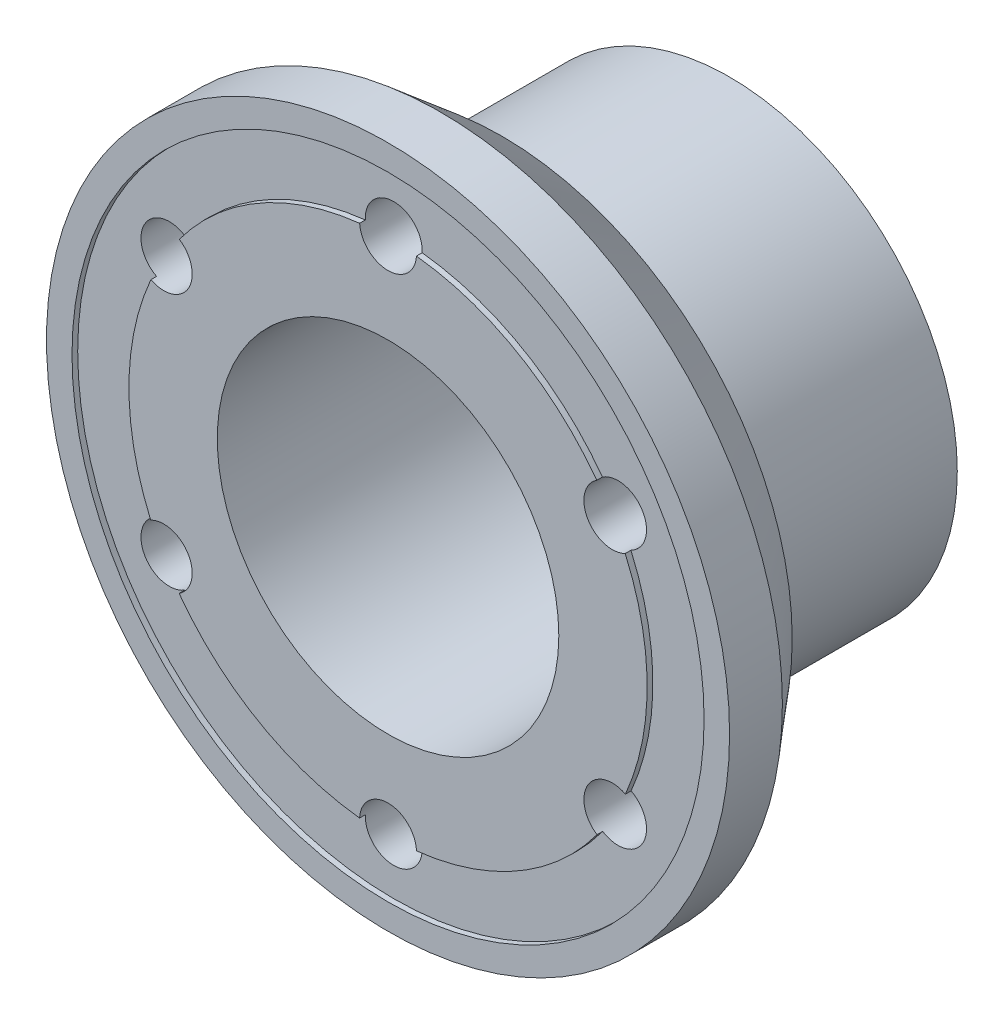
ISO-10303-21;
HEADER;
FILE_DESCRIPTION(('STEP AP214'),'2;1');
FILE_NAME('part.step','',(''),(''),'','','');
FILE_SCHEMA(('AUTOMOTIVE_DESIGN { 1 0 10303 214 1 1 1 1 }'));
ENDSEC;
DATA;
#1=APPLICATION_CONTEXT('core data for automotive mechanical design processes');
#2=APPLICATION_PROTOCOL_DEFINITION('international standard','automotive_design',2000,#1);
#3=PRODUCT_CONTEXT('',#1,'mechanical');
#4=PRODUCT('Part','Part','',(#3));
#5=PRODUCT_RELATED_PRODUCT_CATEGORY('part','',(#4));
#6=PRODUCT_DEFINITION_FORMATION('','',#4);
#7=PRODUCT_DEFINITION_CONTEXT('part definition',#1,'design');
#8=PRODUCT_DEFINITION('design','',#6,#7);
#9=PRODUCT_DEFINITION_SHAPE('','',#8);
#10=(LENGTH_UNIT() NAMED_UNIT(*) SI_UNIT(.MILLI.,.METRE.));
#11=(NAMED_UNIT(*) PLANE_ANGLE_UNIT() SI_UNIT($,.RADIAN.));
#12=(NAMED_UNIT(*) SI_UNIT($,.STERADIAN.) SOLID_ANGLE_UNIT());
#13=UNCERTAINTY_MEASURE_WITH_UNIT(LENGTH_MEASURE(1.E-05),#10,'distance_accuracy_value','');
#14=(GEOMETRIC_REPRESENTATION_CONTEXT(3) GLOBAL_UNCERTAINTY_ASSIGNED_CONTEXT((#13)) GLOBAL_UNIT_ASSIGNED_CONTEXT((#10,
#11,#12)) REPRESENTATION_CONTEXT('',''));
#15=CARTESIAN_POINT('',(0.,0.,0.));
#16=DIRECTION('',(0.,0.,1.));
#17=DIRECTION('',(1.,0.,0.));
#18=AXIS2_PLACEMENT_3D('',#15,#16,#17);
#19=CARTESIAN_POINT('',(0.,0.,60.));
#20=DIRECTION('',(0.,0.,1.));
#21=DIRECTION('',(1.,0.,0.));
#22=AXIS2_PLACEMENT_3D('',#19,#20,#21);
#23=PLANE('',#22);
#24=CARTESIAN_POINT('',(0.,0.,60.));
#25=DIRECTION('',(0.,0.,1.));
#26=DIRECTION('',(1.,0.,0.));
#27=AXIS2_PLACEMENT_3D('',#24,#25,#26);
#28=CIRCLE('',#27,30.);
#29=CARTESIAN_POINT('',(30.,0.,60.));
#30=VERTEX_POINT('',#29);
#31=EDGE_CURVE('E213',#30,#30,#28,.T.);
#32=ORIENTED_EDGE('',*,*,#31,.F.);
#33=EDGE_LOOP('',(#32));
#34=FACE_BOUND('',#33,.T.);
#35=CARTESIAN_POINT('',(39.4041558721932,22.7915878367293,60.));
#36=DIRECTION('',(0.,0.,1.));
#37=DIRECTION('',(1.,0.,0.));
#38=AXIS2_PLACEMENT_3D('',#35,#36,#37);
#39=CIRCLE('',#38,5.);
#40=CARTESIAN_POINT('',(36.6668073140902,26.9757153289852,60.));
#41=VERTEX_POINT('',#40);
#42=CARTESIAN_POINT('',(41.6661012207834,18.3324844246081,60.));
#43=VERTEX_POINT('',#42);
#44=EDGE_CURVE('E183',#41,#43,#39,.T.);
#45=ORIENTED_EDGE('',*,*,#44,.F.);
#46=CARTESIAN_POINT('',(0.,0.,60.));
#47=DIRECTION('',(0.,0.,1.));
#48=DIRECTION('',(1.,0.,0.));
#49=AXIS2_PLACEMENT_3D('',#46,#47,#48);
#50=CIRCLE('',#49,45.5208081663657);
#51=CARTESIAN_POINT('',(4.9912751710628,45.2463385069532,60.));
#52=VERTEX_POINT('',#51);
#53=EDGE_CURVE('E190',#41,#52,#50,.T.);
#54=ORIENTED_EDGE('',*,*,#53,.T.);
#55=CARTESIAN_POINT('',(0.,45.5415878367273,60.));
#56=DIRECTION('',(0.,0.,1.));
#57=DIRECTION('',(1.,0.,0.));
#58=AXIS2_PLACEMENT_3D('',#55,#56,#57);
#59=CIRCLE('',#58,5.);
#60=CARTESIAN_POINT('',(-4.9912751710628,45.2463385069532,60.));
#61=VERTEX_POINT('',#60);
#62=EDGE_CURVE('E209',#61,#52,#59,.T.);
#63=ORIENTED_EDGE('',*,*,#62,.F.);
#64=CARTESIAN_POINT('',(-36.6668073140911,26.975715328984,60.));
#65=VERTEX_POINT('',#64);
#66=EDGE_CURVE('E308',#61,#65,#50,.T.);
#67=ORIENTED_EDGE('',*,*,#66,.T.);
#68=CARTESIAN_POINT('',(-39.4041558721905,22.7915878367257,60.));
#69=DIRECTION('',(0.,0.,1.));
#70=DIRECTION('',(1.,0.,0.));
#71=AXIS2_PLACEMENT_3D('',#68,#69,#70);
#72=CIRCLE('',#71,5.);
#73=CARTESIAN_POINT('',(-41.6661012207842,18.3324844246063,60.));
#74=VERTEX_POINT('',#73);
#75=EDGE_CURVE('E228',#74,#65,#72,.T.);
#76=ORIENTED_EDGE('',*,*,#75,.F.);
#77=CARTESIAN_POINT('',(-41.6959205817945,-18.2645608476019,60.));
#78=VERTEX_POINT('',#77);
#79=EDGE_CURVE('E83',#74,#78,#50,.T.);
#80=ORIENTED_EDGE('',*,*,#79,.T.);
#81=CARTESIAN_POINT('',(-39.4041558721885,-22.7084121632744,60.));
#82=DIRECTION('',(0.,0.,1.));
#83=DIRECTION('',(1.,0.,0.));
#84=AXIS2_PLACEMENT_3D('',#81,#82,#83);
#85=CIRCLE('',#84,5.);
#86=CARTESIAN_POINT('',(-36.7082161891251,-26.9193395225723,60.));
#87=VERTEX_POINT('',#86);
#88=EDGE_CURVE('E224',#87,#78,#85,.T.);
#89=ORIENTED_EDGE('',*,*,#88,.F.);
#90=CARTESIAN_POINT('',(-4.99548072668879,-45.2458743801946,60.));
#91=VERTEX_POINT('',#90);
#92=EDGE_CURVE('E311',#87,#91,#50,.T.);
#93=ORIENTED_EDGE('',*,*,#92,.T.);
#94=CARTESIAN_POINT('',(4.50944079798348E-12,-45.4584121632727,60.));
#95=DIRECTION('',(0.,0.,1.));
#96=DIRECTION('',(1.,0.,0.));
#97=AXIS2_PLACEMENT_3D('',#94,#95,#96);
#98=CIRCLE('',#97,5.);
#99=CARTESIAN_POINT('',(4.99548072669777,-45.2458743801936,60.));
#100=VERTEX_POINT('',#99);
#101=EDGE_CURVE('E220',#100,#91,#98,.T.);
#102=ORIENTED_EDGE('',*,*,#101,.F.);
#103=CARTESIAN_POINT('',(36.7082161891291,-26.9193395225668,60.));
#104=VERTEX_POINT('',#103);
#105=EDGE_CURVE('E193',#100,#104,#50,.T.);
#106=ORIENTED_EDGE('',*,*,#105,.T.);
#107=CARTESIAN_POINT('',(39.4041558721955,-22.7084121632708,60.));
#108=DIRECTION('',(0.,0.,1.));
#109=DIRECTION('',(1.,0.,0.));
#110=AXIS2_PLACEMENT_3D('',#107,#108,#109);
#111=CIRCLE('',#110,5.);
#112=CARTESIAN_POINT('',(41.6959205817971,-18.264560847596,60.));
#113=VERTEX_POINT('',#112);
#114=EDGE_CURVE('E216',#113,#104,#111,.T.);
#115=ORIENTED_EDGE('',*,*,#114,.F.);
#116=EDGE_CURVE('E186',#113,#43,#50,.T.);
#117=ORIENTED_EDGE('',*,*,#116,.T.);
#118=EDGE_LOOP('',(#45,#54,#63,#67,#76,#80,#89,#93,#102,#106,#115,#117));
#119=FACE_BOUND('',#118,.T.);
#120=ADVANCED_FACE('F65',(#34,#119),#23,.T.);
#121=CARTESIAN_POINT('',(0.,45.5415878367273,-30.));
#122=DIRECTION('',(0.,0.,1.));
#123=DIRECTION('',(1.,0.,0.));
#124=AXIS2_PLACEMENT_3D('',#121,#122,#123);
#125=CYLINDRICAL_SURFACE('',#124,5.);
#126=CARTESIAN_POINT('',(0.,45.5415878367273,40.));
#127=DIRECTION('',(0.,0.,1.));
#128=DIRECTION('',(1.,0.,0.));
#129=AXIS2_PLACEMENT_3D('',#126,#127,#128);
#130=CIRCLE('',#129,5.);
#131=CARTESIAN_POINT('',(5.,45.5415878367273,40.));
#132=VERTEX_POINT('',#131);
#133=EDGE_CURVE('E235',#132,#132,#130,.T.);
#134=ORIENTED_EDGE('',*,*,#133,.F.);
#135=EDGE_LOOP('',(#134));
#136=FACE_BOUND('',#135,.T.);
#137=DIRECTION('',(0.,0.,1.));
#138=VECTOR('',#137,1.);
#139=CARTESIAN_POINT('',(4.9912751710628,45.2463385069532,60.5));
#140=LINE('',#139,#138);
#141=CARTESIAN_POINT('',(4.9912751710628,45.2463385069532,59.));
#142=VERTEX_POINT('',#141);
#143=EDGE_CURVE('E91',#142,#52,#140,.T.);
#144=ORIENTED_EDGE('',*,*,#143,.F.);
#145=CARTESIAN_POINT('',(0.,45.5415878367273,59.));
#146=DIRECTION('',(0.,0.,1.));
#147=DIRECTION('',(1.,0.,0.));
#148=AXIS2_PLACEMENT_3D('',#145,#146,#147);
#149=CIRCLE('',#148,5.);
#150=CARTESIAN_POINT('',(-4.9912751710628,45.2463385069532,59.));
#151=VERTEX_POINT('',#150);
#152=EDGE_CURVE('E168',#151,#142,#149,.F.);
#153=ORIENTED_EDGE('',*,*,#152,.F.);
#154=DIRECTION('',(0.,0.,1.));
#155=VECTOR('',#154,1.);
#156=CARTESIAN_POINT('',(-4.9912751710628,45.2463385069532,60.5));
#157=LINE('',#156,#155);
#158=EDGE_CURVE('E301',#61,#151,#157,.F.);
#159=ORIENTED_EDGE('',*,*,#158,.F.);
#160=ORIENTED_EDGE('',*,*,#62,.T.);
#161=EDGE_LOOP('',(#144,#153,#159,#160));
#162=FACE_BOUND('',#161,.T.);
#163=ADVANCED_FACE('F363',(#136,#162),#125,.F.);
#164=CARTESIAN_POINT('',(39.4041558721932,22.7915878367293,-30.));
#165=DIRECTION('',(0.,0.,1.));
#166=DIRECTION('',(1.,0.,0.));
#167=AXIS2_PLACEMENT_3D('',#164,#165,#166);
#168=CYLINDRICAL_SURFACE('',#167,5.);
#169=CARTESIAN_POINT('',(39.4041558721932,22.7915878367293,40.));
#170=DIRECTION('',(0.,0.,1.));
#171=DIRECTION('',(1.,0.,0.));
#172=AXIS2_PLACEMENT_3D('',#169,#170,#171);
#173=CIRCLE('',#172,5.);
#174=CARTESIAN_POINT('',(44.4041558721932,22.7915878367293,40.));
#175=VERTEX_POINT('',#174);
#176=EDGE_CURVE('E257',#175,#175,#173,.T.);
#177=ORIENTED_EDGE('',*,*,#176,.F.);
#178=EDGE_LOOP('',(#177));
#179=FACE_BOUND('',#178,.T.);
#180=DIRECTION('',(0.,0.,1.));
#181=VECTOR('',#180,1.);
#182=CARTESIAN_POINT('',(41.6661012207834,18.3324844246081,60.5));
#183=LINE('',#182,#181);
#184=CARTESIAN_POINT('',(41.6661012207834,18.3324844246081,59.));
#185=VERTEX_POINT('',#184);
#186=EDGE_CURVE('E173',#185,#43,#183,.T.);
#187=ORIENTED_EDGE('',*,*,#186,.F.);
#188=CARTESIAN_POINT('',(39.4041558721932,22.7915878367293,59.));
#189=DIRECTION('',(0.,0.,1.));
#190=DIRECTION('',(1.,0.,0.));
#191=AXIS2_PLACEMENT_3D('',#188,#189,#190);
#192=CIRCLE('',#191,5.);
#193=CARTESIAN_POINT('',(36.6668073140902,26.9757153289852,59.));
#194=VERTEX_POINT('',#193);
#195=EDGE_CURVE('E158',#194,#185,#192,.F.);
#196=ORIENTED_EDGE('',*,*,#195,.F.);
#197=DIRECTION('',(0.,0.,1.));
#198=VECTOR('',#197,1.);
#199=CARTESIAN_POINT('',(36.6668073140902,26.9757153289852,60.5));
#200=LINE('',#199,#198);
#201=EDGE_CURVE('E185',#41,#194,#200,.F.);
#202=ORIENTED_EDGE('',*,*,#201,.F.);
#203=ORIENTED_EDGE('',*,*,#44,.T.);
#204=EDGE_LOOP('',(#187,#196,#202,#203));
#205=FACE_BOUND('',#204,.T.);
#206=ADVANCED_FACE('F181',(#179,#205),#168,.F.);
#207=CARTESIAN_POINT('',(39.4041558721955,-22.7084121632708,-30.));
#208=DIRECTION('',(0.,0.,1.));
#209=DIRECTION('',(1.,0.,0.));
#210=AXIS2_PLACEMENT_3D('',#207,#208,#209);
#211=CYLINDRICAL_SURFACE('',#210,5.);
#212=CARTESIAN_POINT('',(39.4041558721955,-22.7084121632708,40.));
#213=DIRECTION('',(0.,0.,1.));
#214=DIRECTION('',(1.,0.,0.));
#215=AXIS2_PLACEMENT_3D('',#212,#213,#214);
#216=CIRCLE('',#215,5.);
#217=CARTESIAN_POINT('',(44.4041558721955,-22.7084121632708,40.));
#218=VERTEX_POINT('',#217);
#219=EDGE_CURVE('E261',#218,#218,#216,.T.);
#220=ORIENTED_EDGE('',*,*,#219,.F.);
#221=EDGE_LOOP('',(#220));
#222=FACE_BOUND('',#221,.T.);
#223=DIRECTION('',(0.,0.,1.));
#224=VECTOR('',#223,1.);
#225=CARTESIAN_POINT('',(36.7082161891291,-26.9193395225668,60.5));
#226=LINE('',#225,#224);
#227=CARTESIAN_POINT('',(36.7082161891291,-26.9193395225668,59.));
#228=VERTEX_POINT('',#227);
#229=EDGE_CURVE('E331',#228,#104,#226,.T.);
#230=ORIENTED_EDGE('',*,*,#229,.F.);
#231=CARTESIAN_POINT('',(39.4041558721955,-22.7084121632708,59.));
#232=DIRECTION('',(0.,0.,1.));
#233=DIRECTION('',(1.,0.,0.));
#234=AXIS2_PLACEMENT_3D('',#231,#232,#233);
#235=CIRCLE('',#234,5.);
#236=CARTESIAN_POINT('',(41.6959205817971,-18.264560847596,59.));
#237=VERTEX_POINT('',#236);
#238=EDGE_CURVE('E169',#237,#228,#235,.F.);
#239=ORIENTED_EDGE('',*,*,#238,.F.);
#240=DIRECTION('',(0.,0.,1.));
#241=VECTOR('',#240,1.);
#242=CARTESIAN_POINT('',(41.6959205817971,-18.264560847596,60.5));
#243=LINE('',#242,#241);
#244=EDGE_CURVE('E176',#113,#237,#243,.F.);
#245=ORIENTED_EDGE('',*,*,#244,.F.);
#246=ORIENTED_EDGE('',*,*,#114,.T.);
#247=EDGE_LOOP('',(#230,#239,#245,#246));
#248=FACE_BOUND('',#247,.T.);
#249=ADVANCED_FACE('F371',(#222,#248),#211,.F.);
#250=CARTESIAN_POINT('',(4.50944079798348E-12,-45.4584121632727,-30.));
#251=DIRECTION('',(0.,0.,1.));
#252=DIRECTION('',(1.,0.,0.));
#253=AXIS2_PLACEMENT_3D('',#250,#251,#252);
#254=CYLINDRICAL_SURFACE('',#253,5.);
#255=CARTESIAN_POINT('',(4.50944079798348E-12,-45.4584121632727,40.));
#256=DIRECTION('',(0.,0.,1.));
#257=DIRECTION('',(1.,0.,0.));
#258=AXIS2_PLACEMENT_3D('',#255,#256,#257);
#259=CIRCLE('',#258,5.);
#260=CARTESIAN_POINT('',(5.00000000000451,-45.4584121632727,40.));
#261=VERTEX_POINT('',#260);
#262=EDGE_CURVE('E265',#261,#261,#259,.T.);
#263=ORIENTED_EDGE('',*,*,#262,.F.);
#264=EDGE_LOOP('',(#263));
#265=FACE_BOUND('',#264,.T.);
#266=DIRECTION('',(0.,0.,1.));
#267=VECTOR('',#266,1.);
#268=CARTESIAN_POINT('',(-4.99548072668879,-45.2458743801946,60.5));
#269=LINE('',#268,#267);
#270=CARTESIAN_POINT('',(-4.99548072668879,-45.2458743801946,59.));
#271=VERTEX_POINT('',#270);
#272=EDGE_CURVE('E322',#271,#91,#269,.T.);
#273=ORIENTED_EDGE('',*,*,#272,.F.);
#274=CARTESIAN_POINT('',(4.50944079798348E-12,-45.4584121632727,59.));
#275=DIRECTION('',(0.,0.,1.));
#276=DIRECTION('',(1.,0.,0.));
#277=AXIS2_PLACEMENT_3D('',#274,#275,#276);
#278=CIRCLE('',#277,5.);
#279=CARTESIAN_POINT('',(4.99548072669775,-45.2458743801936,59.));
#280=VERTEX_POINT('',#279);
#281=EDGE_CURVE('E202',#280,#271,#278,.F.);
#282=ORIENTED_EDGE('',*,*,#281,.F.);
#283=DIRECTION('',(0.,0.,1.));
#284=VECTOR('',#283,1.);
#285=CARTESIAN_POINT('',(4.99548072669777,-45.2458743801936,60.5));
#286=LINE('',#285,#284);
#287=EDGE_CURVE('E326',#100,#280,#286,.F.);
#288=ORIENTED_EDGE('',*,*,#287,.F.);
#289=ORIENTED_EDGE('',*,*,#101,.T.);
#290=EDGE_LOOP('',(#273,#282,#288,#289));
#291=FACE_BOUND('',#290,.T.);
#292=ADVANCED_FACE('F349',(#265,#291),#254,.F.);
#293=CARTESIAN_POINT('',(-39.4041558721885,-22.7084121632744,-30.));
#294=DIRECTION('',(0.,0.,1.));
#295=DIRECTION('',(1.,0.,0.));
#296=AXIS2_PLACEMENT_3D('',#293,#294,#295);
#297=CYLINDRICAL_SURFACE('',#296,5.);
#298=CARTESIAN_POINT('',(-39.4041558721885,-22.7084121632744,40.));
#299=DIRECTION('',(0.,0.,1.));
#300=DIRECTION('',(1.,0.,0.));
#301=AXIS2_PLACEMENT_3D('',#298,#299,#300);
#302=CIRCLE('',#301,5.);
#303=CARTESIAN_POINT('',(-34.4041558721885,-22.7084121632744,40.));
#304=VERTEX_POINT('',#303);
#305=EDGE_CURVE('E269',#304,#304,#302,.T.);
#306=ORIENTED_EDGE('',*,*,#305,.F.);
#307=EDGE_LOOP('',(#306));
#308=FACE_BOUND('',#307,.T.);
#309=DIRECTION('',(0.,0.,1.));
#310=VECTOR('',#309,1.);
#311=CARTESIAN_POINT('',(-41.6959205817945,-18.2645608476018,60.5));
#312=LINE('',#311,#310);
#313=CARTESIAN_POINT('',(-41.6959205817945,-18.2645608476018,59.));
#314=VERTEX_POINT('',#313);
#315=EDGE_CURVE('E310',#314,#78,#312,.T.);
#316=ORIENTED_EDGE('',*,*,#315,.F.);
#317=CARTESIAN_POINT('',(-39.4041558721885,-22.7084121632744,59.));
#318=DIRECTION('',(0.,0.,1.));
#319=DIRECTION('',(1.,0.,0.));
#320=AXIS2_PLACEMENT_3D('',#317,#318,#319);
#321=CIRCLE('',#320,5.);
#322=CARTESIAN_POINT('',(-36.7082161891251,-26.9193395225723,59.));
#323=VERTEX_POINT('',#322);
#324=EDGE_CURVE('E199',#323,#314,#321,.F.);
#325=ORIENTED_EDGE('',*,*,#324,.F.);
#326=DIRECTION('',(0.,0.,1.));
#327=VECTOR('',#326,1.);
#328=CARTESIAN_POINT('',(-36.7082161891251,-26.9193395225723,60.5));
#329=LINE('',#328,#327);
#330=EDGE_CURVE('E314',#87,#323,#329,.F.);
#331=ORIENTED_EDGE('',*,*,#330,.F.);
#332=ORIENTED_EDGE('',*,*,#88,.T.);
#333=EDGE_LOOP('',(#316,#325,#331,#332));
#334=FACE_BOUND('',#333,.T.);
#335=ADVANCED_FACE('F387',(#308,#334),#297,.F.);
#336=CARTESIAN_POINT('',(-39.4041558721905,22.7915878367257,-30.));
#337=DIRECTION('',(0.,0.,1.));
#338=DIRECTION('',(1.,0.,0.));
#339=AXIS2_PLACEMENT_3D('',#336,#337,#338);
#340=CYLINDRICAL_SURFACE('',#339,5.);
#341=CARTESIAN_POINT('',(-39.4041558721905,22.7915878367257,40.));
#342=DIRECTION('',(0.,0.,1.));
#343=DIRECTION('',(1.,0.,0.));
#344=AXIS2_PLACEMENT_3D('',#341,#342,#343);
#345=CIRCLE('',#344,5.);
#346=CARTESIAN_POINT('',(-34.4041558721905,22.7915878367257,40.));
#347=VERTEX_POINT('',#346);
#348=EDGE_CURVE('E241',#347,#347,#345,.T.);
#349=ORIENTED_EDGE('',*,*,#348,.F.);
#350=EDGE_LOOP('',(#349));
#351=FACE_BOUND('',#350,.T.);
#352=DIRECTION('',(0.,0.,1.));
#353=VECTOR('',#352,1.);
#354=CARTESIAN_POINT('',(-36.6668073140911,26.975715328984,60.5));
#355=LINE('',#354,#353);
#356=CARTESIAN_POINT('',(-36.6668073140911,26.975715328984,59.));
#357=VERTEX_POINT('',#356);
#358=EDGE_CURVE('E12',#357,#65,#355,.T.);
#359=ORIENTED_EDGE('',*,*,#358,.F.);
#360=CARTESIAN_POINT('',(-39.4041558721905,22.7915878367257,59.));
#361=DIRECTION('',(0.,0.,1.));
#362=DIRECTION('',(1.,0.,0.));
#363=AXIS2_PLACEMENT_3D('',#360,#361,#362);
#364=CIRCLE('',#363,5.);
#365=CARTESIAN_POINT('',(-41.6661012207842,18.3324844246063,59.));
#366=VERTEX_POINT('',#365);
#367=EDGE_CURVE('E76',#366,#357,#364,.F.);
#368=ORIENTED_EDGE('',*,*,#367,.F.);
#369=DIRECTION('',(0.,0.,1.));
#370=VECTOR('',#369,1.);
#371=CARTESIAN_POINT('',(-41.6661012207842,18.3324844246063,60.5));
#372=LINE('',#371,#370);
#373=EDGE_CURVE('E283',#74,#366,#372,.F.);
#374=ORIENTED_EDGE('',*,*,#373,.F.);
#375=ORIENTED_EDGE('',*,*,#75,.T.);
#376=EDGE_LOOP('',(#359,#368,#374,#375));
#377=FACE_BOUND('',#376,.T.);
#378=ADVANCED_FACE('F303',(#351,#377),#340,.F.);
#379=CARTESIAN_POINT('',(0.,0.,0.));
#380=DIRECTION('',(0.,0.,1.));
#381=DIRECTION('',(1.,0.,0.));
#382=AXIS2_PLACEMENT_3D('',#379,#380,#381);
#383=PLANE('',#382);
#384=CARTESIAN_POINT('',(0.,0.,0.));
#385=DIRECTION('',(0.,0.,1.));
#386=DIRECTION('',(1.,0.,0.));
#387=AXIS2_PLACEMENT_3D('',#384,#385,#386);
#388=CIRCLE('',#387,30.);
#389=CARTESIAN_POINT('',(30.,0.,0.));
#390=VERTEX_POINT('',#389);
#391=EDGE_CURVE('E236',#390,#390,#388,.T.);
#392=ORIENTED_EDGE('',*,*,#391,.T.);
#393=EDGE_LOOP('',(#392));
#394=FACE_BOUND('',#393,.T.);
#395=CARTESIAN_POINT('',(0.,0.,0.));
#396=DIRECTION('',(0.,0.,1.));
#397=DIRECTION('',(1.,0.,0.));
#398=AXIS2_PLACEMENT_3D('',#395,#396,#397);
#399=CIRCLE('',#398,40.);
#400=CARTESIAN_POINT('',(40.,0.,0.));
#401=VERTEX_POINT('',#400);
#402=EDGE_CURVE('E245',#401,#401,#399,.T.);
#403=ORIENTED_EDGE('',*,*,#402,.F.);
#404=EDGE_LOOP('',(#403));
#405=FACE_BOUND('',#404,.T.);
#406=ADVANCED_FACE('F394',(#394,#405),#383,.F.);
#407=CARTESIAN_POINT('',(0.,0.,40.));
#408=DIRECTION('',(0.,0.,-1.));
#409=DIRECTION('',(-1.,0.,0.));
#410=AXIS2_PLACEMENT_3D('',#407,#408,#409);
#411=CYLINDRICAL_SURFACE('',#410,40.);
#412=CARTESIAN_POINT('',(0.,0.,40.));
#413=DIRECTION('',(0.,0.,1.));
#414=DIRECTION('',(1.,0.,0.));
#415=AXIS2_PLACEMENT_3D('',#412,#413,#414);
#416=CIRCLE('',#415,40.);
#417=CARTESIAN_POINT('',(40.,0.,40.));
#418=VERTEX_POINT('',#417);
#419=EDGE_CURVE('E246',#418,#418,#416,.T.);
#420=ORIENTED_EDGE('',*,*,#419,.F.);
#421=EDGE_LOOP('',(#420));
#422=FACE_BOUND('',#421,.T.);
#423=ORIENTED_EDGE('',*,*,#402,.T.);
#424=EDGE_LOOP('',(#423));
#425=FACE_BOUND('',#424,.T.);
#426=ADVANCED_FACE('F409',(#422,#425),#411,.T.);
#427=CARTESIAN_POINT('',(0.,0.,60.));
#428=DIRECTION('',(0.,0.,-1.));
#429=DIRECTION('',(-1.,0.,0.));
#430=AXIS2_PLACEMENT_3D('',#427,#428,#429);
#431=CYLINDRICAL_SURFACE('',#430,60.);
#432=CARTESIAN_POINT('',(0.,0.,50.7257823333479));
#433=DIRECTION('',(0.,0.,1.));
#434=DIRECTION('',(1.,0.,0.));
#435=AXIS2_PLACEMENT_3D('',#432,#433,#434);
#436=CIRCLE('',#435,60.);
#437=CARTESIAN_POINT('',(60.,0.,50.7257823333479));
#438=VERTEX_POINT('',#437);
#439=EDGE_CURVE('E250',#438,#438,#436,.T.);
#440=ORIENTED_EDGE('',*,*,#439,.T.);
#441=EDGE_LOOP('',(#440));
#442=FACE_BOUND('',#441,.T.);
#443=CARTESIAN_POINT('',(0.,0.,60.));
#444=DIRECTION('',(0.,0.,1.));
#445=DIRECTION('',(1.,0.,0.));
#446=AXIS2_PLACEMENT_3D('',#443,#444,#445);
#447=CIRCLE('',#446,60.);
#448=CARTESIAN_POINT('',(60.,0.,60.));
#449=VERTEX_POINT('',#448);
#450=EDGE_CURVE('E240',#449,#449,#447,.T.);
#451=ORIENTED_EDGE('',*,*,#450,.F.);
#452=EDGE_LOOP('',(#451));
#453=FACE_BOUND('',#452,.T.);
#454=ADVANCED_FACE('F402',(#442,#453),#431,.T.);
#455=CARTESIAN_POINT('',(0.,0.,60.));
#456=DIRECTION('',(0.,0.,1.));
#457=DIRECTION('',(1.,0.,0.));
#458=AXIS2_PLACEMENT_3D('',#455,#456,#457);
#459=CIRCLE('',#458,55.5208081663657);
#460=CARTESIAN_POINT('',(55.5208081663657,0.,60.));
#461=VERTEX_POINT('',#460);
#462=EDGE_CURVE('E70',#461,#461,#459,.T.);
#463=ORIENTED_EDGE('',*,*,#462,.F.);
#464=EDGE_LOOP('',(#463));
#465=FACE_BOUND('',#464,.T.);
#466=ORIENTED_EDGE('',*,*,#450,.T.);
#467=EDGE_LOOP('',(#466));
#468=FACE_BOUND('',#467,.T.);
#469=ADVANCED_FACE('F376',(#465,#468),#23,.T.);
#470=CARTESIAN_POINT('',(0.,0.,40.));
#471=DIRECTION('',(0.,0.,1.));
#472=DIRECTION('',(1.,0.,0.));
#473=AXIS2_PLACEMENT_3D('',#470,#471,#472);
#474=PLANE('',#473);
#475=CARTESIAN_POINT('',(0.,0.,40.));
#476=DIRECTION('',(0.,0.,1.));
#477=DIRECTION('',(1.,0.,0.));
#478=AXIS2_PLACEMENT_3D('',#475,#476,#477);
#479=CIRCLE('',#478,51.);
#480=CARTESIAN_POINT('',(51.,0.,40.));
#481=VERTEX_POINT('',#480);
#482=EDGE_CURVE('E279',#481,#481,#479,.F.);
#483=ORIENTED_EDGE('',*,*,#482,.T.);
#484=EDGE_LOOP('',(#483));
#485=FACE_BOUND('',#484,.T.);
#486=ORIENTED_EDGE('',*,*,#348,.T.);
#487=EDGE_LOOP('',(#486));
#488=FACE_BOUND('',#487,.T.);
#489=ORIENTED_EDGE('',*,*,#305,.T.);
#490=EDGE_LOOP('',(#489));
#491=FACE_BOUND('',#490,.T.);
#492=ORIENTED_EDGE('',*,*,#262,.T.);
#493=EDGE_LOOP('',(#492));
#494=FACE_BOUND('',#493,.T.);
#495=ORIENTED_EDGE('',*,*,#219,.T.);
#496=EDGE_LOOP('',(#495));
#497=FACE_BOUND('',#496,.T.);
#498=ORIENTED_EDGE('',*,*,#176,.T.);
#499=EDGE_LOOP('',(#498));
#500=FACE_BOUND('',#499,.T.);
#501=ORIENTED_EDGE('',*,*,#133,.T.);
#502=EDGE_LOOP('',(#501));
#503=FACE_BOUND('',#502,.T.);
#504=ORIENTED_EDGE('',*,*,#419,.T.);
#505=EDGE_LOOP('',(#504));
#506=FACE_BOUND('',#505,.T.);
#507=ADVANCED_FACE('F398',(#485,#488,#491,#494,#497,#500,#503,#506),#474,.F.);
#508=CARTESIAN_POINT('',(0.,0.,-30.));
#509=DIRECTION('',(0.,0.,1.));
#510=DIRECTION('',(1.,0.,0.));
#511=AXIS2_PLACEMENT_3D('',#508,#509,#510);
#512=CYLINDRICAL_SURFACE('',#511,30.);
#513=ORIENTED_EDGE('',*,*,#31,.T.);
#514=EDGE_LOOP('',(#513));
#515=FACE_BOUND('',#514,.T.);
#516=ORIENTED_EDGE('',*,*,#391,.F.);
#517=EDGE_LOOP('',(#516));
#518=FACE_BOUND('',#517,.T.);
#519=ADVANCED_FACE('F396',(#515,#518),#512,.F.);
#520=CARTESIAN_POINT('',(0.,0.,50.7257823333479));
#521=DIRECTION('',(0.,0.,1.));
#522=DIRECTION('',(1.,0.,0.));
#523=AXIS2_PLACEMENT_3D('',#520,#521,#522);
#524=CONICAL_SURFACE('',#523,60.,0.698131700797734);
#525=ORIENTED_EDGE('',*,*,#482,.F.);
#526=EDGE_LOOP('',(#525));
#527=FACE_BOUND('',#526,.T.);
#528=ORIENTED_EDGE('',*,*,#439,.F.);
#529=EDGE_LOOP('',(#528));
#530=FACE_BOUND('',#529,.T.);
#531=ADVANCED_FACE('F68',(#527,#530),#524,.T.);
#532=CARTESIAN_POINT('',(0.,0.,59.));
#533=DIRECTION('',(0.,0.,1.));
#534=DIRECTION('',(1.,0.,0.));
#535=AXIS2_PLACEMENT_3D('',#532,#533,#534);
#536=PLANE('',#535);
#537=CARTESIAN_POINT('',(0.,0.,59.));
#538=DIRECTION('',(0.,0.,1.));
#539=DIRECTION('',(1.,0.,0.));
#540=AXIS2_PLACEMENT_3D('',#537,#538,#539);
#541=CIRCLE('',#540,55.5208081663657);
#542=CARTESIAN_POINT('',(55.5208081663657,0.,59.));
#543=VERTEX_POINT('',#542);
#544=EDGE_CURVE('E319',#543,#543,#541,.T.);
#545=ORIENTED_EDGE('',*,*,#544,.T.);
#546=EDGE_LOOP('',(#545));
#547=FACE_BOUND('',#546,.T.);
#548=ORIENTED_EDGE('',*,*,#152,.T.);
#549=CARTESIAN_POINT('',(0.,0.,59.));
#550=DIRECTION('',(0.,0.,1.));
#551=DIRECTION('',(1.,0.,0.));
#552=AXIS2_PLACEMENT_3D('',#549,#550,#551);
#553=CIRCLE('',#552,45.5208081663657);
#554=EDGE_CURVE('E163',#194,#142,#553,.T.);
#555=ORIENTED_EDGE('',*,*,#554,.F.);
#556=ORIENTED_EDGE('',*,*,#195,.T.);
#557=EDGE_CURVE('E161',#237,#185,#553,.T.);
#558=ORIENTED_EDGE('',*,*,#557,.F.);
#559=ORIENTED_EDGE('',*,*,#238,.T.);
#560=EDGE_CURVE('E178',#280,#228,#553,.T.);
#561=ORIENTED_EDGE('',*,*,#560,.F.);
#562=ORIENTED_EDGE('',*,*,#281,.T.);
#563=EDGE_CURVE('E347',#323,#271,#553,.T.);
#564=ORIENTED_EDGE('',*,*,#563,.F.);
#565=ORIENTED_EDGE('',*,*,#324,.T.);
#566=EDGE_CURVE('E294',#366,#314,#553,.T.);
#567=ORIENTED_EDGE('',*,*,#566,.F.);
#568=ORIENTED_EDGE('',*,*,#367,.T.);
#569=EDGE_CURVE('E291',#151,#357,#553,.T.);
#570=ORIENTED_EDGE('',*,*,#569,.F.);
#571=EDGE_LOOP('',(#548,#555,#556,#558,#559,#561,#562,#564,#565,#567,#568,#570));
#572=FACE_BOUND('',#571,.T.);
#573=ADVANCED_FACE('F160',(#547,#572),#536,.T.);
#574=CARTESIAN_POINT('',(0.,0.,59.));
#575=DIRECTION('',(0.,0.,1.));
#576=DIRECTION('',(1.,0.,0.));
#577=AXIS2_PLACEMENT_3D('',#574,#575,#576);
#578=CYLINDRICAL_SURFACE('',#577,45.5208081663657);
#579=ORIENTED_EDGE('',*,*,#143,.T.);
#580=ORIENTED_EDGE('',*,*,#53,.F.);
#581=ORIENTED_EDGE('',*,*,#201,.T.);
#582=ORIENTED_EDGE('',*,*,#554,.T.);
#583=EDGE_LOOP('',(#579,#580,#581,#582));
#584=FACE_BOUND('',#583,.T.);
#585=ADVANCED_FACE('F361',(#584),#578,.T.);
#586=ORIENTED_EDGE('',*,*,#186,.T.);
#587=ORIENTED_EDGE('',*,*,#116,.F.);
#588=ORIENTED_EDGE('',*,*,#244,.T.);
#589=ORIENTED_EDGE('',*,*,#557,.T.);
#590=EDGE_LOOP('',(#586,#587,#588,#589));
#591=FACE_BOUND('',#590,.T.);
#592=ADVANCED_FACE('F172',(#591),#578,.T.);
#593=ORIENTED_EDGE('',*,*,#229,.T.);
#594=ORIENTED_EDGE('',*,*,#105,.F.);
#595=ORIENTED_EDGE('',*,*,#287,.T.);
#596=ORIENTED_EDGE('',*,*,#560,.T.);
#597=EDGE_LOOP('',(#593,#594,#595,#596));
#598=FACE_BOUND('',#597,.T.);
#599=ADVANCED_FACE('F340',(#598),#578,.T.);
#600=ORIENTED_EDGE('',*,*,#272,.T.);
#601=ORIENTED_EDGE('',*,*,#92,.F.);
#602=ORIENTED_EDGE('',*,*,#330,.T.);
#603=ORIENTED_EDGE('',*,*,#563,.T.);
#604=EDGE_LOOP('',(#600,#601,#602,#603));
#605=FACE_BOUND('',#604,.T.);
#606=ADVANCED_FACE('F351',(#605),#578,.T.);
#607=ORIENTED_EDGE('',*,*,#158,.T.);
#608=ORIENTED_EDGE('',*,*,#569,.T.);
#609=ORIENTED_EDGE('',*,*,#358,.T.);
#610=ORIENTED_EDGE('',*,*,#66,.F.);
#611=EDGE_LOOP('',(#607,#608,#609,#610));
#612=FACE_BOUND('',#611,.T.);
#613=ADVANCED_FACE('F298',(#612),#578,.T.);
#614=ORIENTED_EDGE('',*,*,#315,.T.);
#615=ORIENTED_EDGE('',*,*,#79,.F.);
#616=ORIENTED_EDGE('',*,*,#373,.T.);
#617=ORIENTED_EDGE('',*,*,#566,.T.);
#618=EDGE_LOOP('',(#614,#615,#616,#617));
#619=FACE_BOUND('',#618,.T.);
#620=ADVANCED_FACE('F475',(#619),#578,.T.);
#621=CARTESIAN_POINT('',(0.,0.,59.));
#622=DIRECTION('',(0.,0.,1.));
#623=DIRECTION('',(1.,0.,0.));
#624=AXIS2_PLACEMENT_3D('',#621,#622,#623);
#625=CYLINDRICAL_SURFACE('',#624,55.5208081663657);
#626=ORIENTED_EDGE('',*,*,#462,.T.);
#627=EDGE_LOOP('',(#626));
#628=FACE_BOUND('',#627,.T.);
#629=ORIENTED_EDGE('',*,*,#544,.F.);
#630=EDGE_LOOP('',(#629));
#631=FACE_BOUND('',#630,.T.);
#632=ADVANCED_FACE('F379',(#628,#631),#625,.F.);
#633=CLOSED_SHELL('',(#120,#163,#206,#249,#292,#335,#378,#406,#426,#454,#469,#507,#519,#531,
#573,#585,#592,#599,#606,#613,#620,#632));
#634=MANIFOLD_SOLID_BREP('B2',#633);
#635=ADVANCED_BREP_SHAPE_REPRESENTATION('',(#18,#634),#14);
#636=SHAPE_DEFINITION_REPRESENTATION(#9,#635);
ENDSEC;
END-ISO-10303-21;
